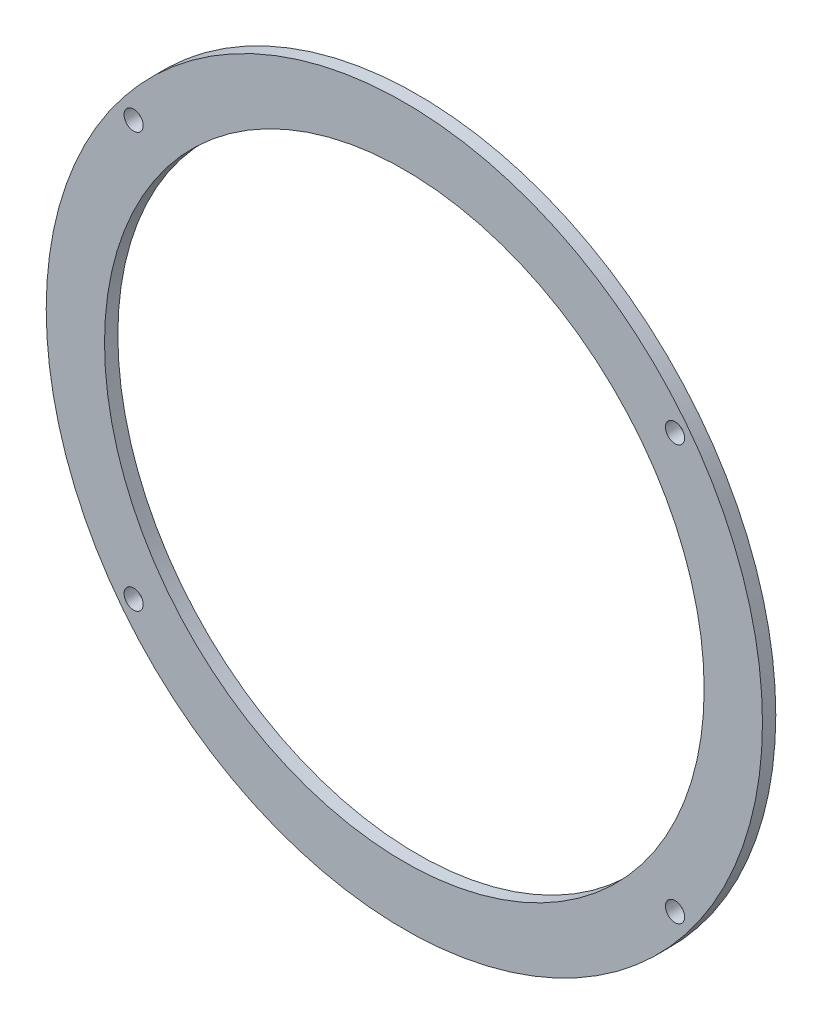
ISO-10303-21;
HEADER;
FILE_DESCRIPTION(('STEP AP214'),'2;1');
FILE_NAME('part.step','',(''),(''),'','','');
FILE_SCHEMA(('AUTOMOTIVE_DESIGN { 1 0 10303 214 1 1 1 1 }'));
ENDSEC;
DATA;
#1=APPLICATION_CONTEXT('core data for automotive mechanical design processes');
#2=APPLICATION_PROTOCOL_DEFINITION('international standard','automotive_design',2000,#1);
#3=PRODUCT_CONTEXT('',#1,'mechanical');
#4=PRODUCT('Part','Part','',(#3));
#5=PRODUCT_RELATED_PRODUCT_CATEGORY('part','',(#4));
#6=PRODUCT_DEFINITION_FORMATION('','',#4);
#7=PRODUCT_DEFINITION_CONTEXT('part definition',#1,'design');
#8=PRODUCT_DEFINITION('design','',#6,#7);
#9=PRODUCT_DEFINITION_SHAPE('','',#8);
#10=(LENGTH_UNIT() NAMED_UNIT(*) SI_UNIT(.MILLI.,.METRE.));
#11=(NAMED_UNIT(*) PLANE_ANGLE_UNIT() SI_UNIT($,.RADIAN.));
#12=(NAMED_UNIT(*) SI_UNIT($,.STERADIAN.) SOLID_ANGLE_UNIT());
#13=UNCERTAINTY_MEASURE_WITH_UNIT(LENGTH_MEASURE(1.E-05),#10,'distance_accuracy_value','');
#14=(GEOMETRIC_REPRESENTATION_CONTEXT(3) GLOBAL_UNCERTAINTY_ASSIGNED_CONTEXT((#13)) GLOBAL_UNIT_ASSIGNED_CONTEXT((#10,
#11,#12)) REPRESENTATION_CONTEXT('',''));
#15=CARTESIAN_POINT('',(0.,0.,0.));
#16=DIRECTION('',(0.,0.,1.));
#17=DIRECTION('',(1.,0.,0.));
#18=AXIS2_PLACEMENT_3D('',#15,#16,#17);
#19=CARTESIAN_POINT('',(0.,0.,0.));
#20=DIRECTION('',(0.,0.,1.));
#21=DIRECTION('',(1.,0.,0.));
#22=AXIS2_PLACEMENT_3D('',#19,#20,#21);
#23=PLANE('',#22);
#24=DIRECTION('',(0.,1.,0.));
#25=VECTOR('',#24,1.);
#26=CARTESIAN_POINT('',(3.3,41.8,0.));
#27=LINE('',#26,#25);
#28=CARTESIAN_POINT('',(3.3,39.5,0.));
#29=VERTEX_POINT('',#28);
#30=CARTESIAN_POINT('',(3.3,41.8,0.));
#31=VERTEX_POINT('',#30);
#32=EDGE_CURVE('E223',#29,#31,#27,.T.);
#33=ORIENTED_EDGE('',*,*,#32,.F.);
#34=DIRECTION('',(-1.,0.,0.));
#35=VECTOR('',#34,1.);
#36=CARTESIAN_POINT('',(3.3,39.5,0.));
#37=LINE('',#36,#35);
#38=CARTESIAN_POINT('',(4.5,39.5,0.));
#39=VERTEX_POINT('',#38);
#40=EDGE_CURVE('E236',#39,#29,#37,.T.);
#41=ORIENTED_EDGE('',*,*,#40,.F.);
#42=DIRECTION('',(0.,-1.,0.));
#43=VECTOR('',#42,1.);
#44=CARTESIAN_POINT('',(4.5,41.8,0.));
#45=LINE('',#44,#43);
#46=CARTESIAN_POINT('',(4.5,41.8,0.));
#47=VERTEX_POINT('',#46);
#48=EDGE_CURVE('E245',#47,#39,#45,.T.);
#49=ORIENTED_EDGE('',*,*,#48,.F.);
#50=DIRECTION('',(1.,0.,0.));
#51=VECTOR('',#50,1.);
#52=CARTESIAN_POINT('',(3.3,41.8,0.));
#53=LINE('',#52,#51);
#54=EDGE_CURVE('E226',#31,#47,#53,.T.);
#55=ORIENTED_EDGE('',*,*,#54,.F.);
#56=EDGE_LOOP('',(#33,#41,#49,#55));
#57=FACE_BOUND('',#56,.T.);
#58=DIRECTION('',(0.,1.,0.));
#59=VECTOR('',#58,1.);
#60=CARTESIAN_POINT('',(0.7,41.8,0.));
#61=LINE('',#60,#59);
#62=CARTESIAN_POINT('',(0.700000000000001,39.5,0.));
#63=VERTEX_POINT('',#62);
#64=CARTESIAN_POINT('',(0.7,41.8,0.));
#65=VERTEX_POINT('',#64);
#66=EDGE_CURVE('E294',#63,#65,#61,.T.);
#67=ORIENTED_EDGE('',*,*,#66,.F.);
#68=DIRECTION('',(-1.,0.,0.));
#69=VECTOR('',#68,1.);
#70=CARTESIAN_POINT('',(0.700000000000001,39.5,0.));
#71=LINE('',#70,#69);
#72=CARTESIAN_POINT('',(1.9,39.5,0.));
#73=VERTEX_POINT('',#72);
#74=EDGE_CURVE('E299',#73,#63,#71,.T.);
#75=ORIENTED_EDGE('',*,*,#74,.F.);
#76=DIRECTION('',(0.,-1.,0.));
#77=VECTOR('',#76,1.);
#78=CARTESIAN_POINT('',(1.9,41.8,0.));
#79=LINE('',#78,#77);
#80=CARTESIAN_POINT('',(1.9,41.8,0.));
#81=VERTEX_POINT('',#80);
#82=EDGE_CURVE('E311',#81,#73,#79,.T.);
#83=ORIENTED_EDGE('',*,*,#82,.F.);
#84=DIRECTION('',(1.,0.,0.));
#85=VECTOR('',#84,1.);
#86=CARTESIAN_POINT('',(0.7,41.8,0.));
#87=LINE('',#86,#85);
#88=EDGE_CURVE('E308',#65,#81,#87,.T.);
#89=ORIENTED_EDGE('',*,*,#88,.F.);
#90=EDGE_LOOP('',(#67,#75,#83,#89));
#91=FACE_BOUND('',#90,.T.);
#92=CARTESIAN_POINT('',(0.,0.,0.));
#93=DIRECTION('',(0.,0.,1.));
#94=DIRECTION('',(1.,0.,0.));
#95=AXIS2_PLACEMENT_3D('',#92,#93,#94);
#96=CIRCLE('',#95,43.);
#97=CARTESIAN_POINT('',(43.,0.,0.));
#98=VERTEX_POINT('',#97);
#99=EDGE_CURVE('E93',#98,#98,#96,.T.);
#100=ORIENTED_EDGE('',*,*,#99,.F.);
#101=EDGE_LOOP('',(#100));
#102=FACE_BOUND('',#101,.T.);
#103=CARTESIAN_POINT('',(32.5,-24.9,0.));
#104=DIRECTION('',(0.,0.,1.));
#105=DIRECTION('',(1.,0.,0.));
#106=AXIS2_PLACEMENT_3D('',#103,#104,#105);
#107=CIRCLE('',#106,1.15);
#108=CARTESIAN_POINT('',(33.65,-24.9,0.));
#109=VERTEX_POINT('',#108);
#110=EDGE_CURVE('E349',#109,#109,#107,.T.);
#111=ORIENTED_EDGE('',*,*,#110,.T.);
#112=EDGE_LOOP('',(#111));
#113=FACE_BOUND('',#112,.T.);
#114=CARTESIAN_POINT('',(-32.5,-24.9,0.));
#115=DIRECTION('',(0.,0.,1.));
#116=DIRECTION('',(1.,0.,0.));
#117=AXIS2_PLACEMENT_3D('',#114,#115,#116);
#118=CIRCLE('',#117,1.15);
#119=CARTESIAN_POINT('',(-31.35,-24.9,0.));
#120=VERTEX_POINT('',#119);
#121=EDGE_CURVE('E343',#120,#120,#118,.T.);
#122=ORIENTED_EDGE('',*,*,#121,.T.);
#123=EDGE_LOOP('',(#122));
#124=FACE_BOUND('',#123,.T.);
#125=CARTESIAN_POINT('',(0.,0.,0.));
#126=DIRECTION('',(0.,0.,1.));
#127=DIRECTION('',(1.,0.,0.));
#128=AXIS2_PLACEMENT_3D('',#125,#126,#127);
#129=CIRCLE('',#128,36.);
#130=CARTESIAN_POINT('',(36.,0.,0.));
#131=VERTEX_POINT('',#130);
#132=EDGE_CURVE('E337',#131,#131,#129,.T.);
#133=ORIENTED_EDGE('',*,*,#132,.T.);
#134=EDGE_LOOP('',(#133));
#135=FACE_BOUND('',#134,.T.);
#136=CARTESIAN_POINT('',(-32.5,24.9,0.));
#137=DIRECTION('',(0.,0.,1.));
#138=DIRECTION('',(1.,0.,0.));
#139=AXIS2_PLACEMENT_3D('',#136,#137,#138);
#140=CIRCLE('',#139,1.15);
#141=CARTESIAN_POINT('',(-31.35,24.9,0.));
#142=VERTEX_POINT('',#141);
#143=EDGE_CURVE('E331',#142,#142,#140,.T.);
#144=ORIENTED_EDGE('',*,*,#143,.T.);
#145=EDGE_LOOP('',(#144));
#146=FACE_BOUND('',#145,.T.);
#147=CARTESIAN_POINT('',(32.5,24.9,0.));
#148=DIRECTION('',(0.,0.,1.));
#149=DIRECTION('',(1.,0.,0.));
#150=AXIS2_PLACEMENT_3D('',#147,#148,#149);
#151=CIRCLE('',#150,1.15);
#152=CARTESIAN_POINT('',(33.65,24.9,0.));
#153=VERTEX_POINT('',#152);
#154=EDGE_CURVE('E327',#153,#153,#151,.T.);
#155=ORIENTED_EDGE('',*,*,#154,.T.);
#156=EDGE_LOOP('',(#155));
#157=FACE_BOUND('',#156,.T.);
#158=DIRECTION('',(0.,1.,0.));
#159=VECTOR('',#158,1.);
#160=CARTESIAN_POINT('',(-4.5,41.8,0.));
#161=LINE('',#160,#159);
#162=CARTESIAN_POINT('',(-4.5,39.5,0.));
#163=VERTEX_POINT('',#162);
#164=CARTESIAN_POINT('',(-4.5,41.8,0.));
#165=VERTEX_POINT('',#164);
#166=EDGE_CURVE('E261',#163,#165,#161,.T.);
#167=ORIENTED_EDGE('',*,*,#166,.F.);
#168=DIRECTION('',(-1.,0.,0.));
#169=VECTOR('',#168,1.);
#170=CARTESIAN_POINT('',(-3.3,39.5,0.));
#171=LINE('',#170,#169);
#172=CARTESIAN_POINT('',(-3.3,39.5,0.));
#173=VERTEX_POINT('',#172);
#174=EDGE_CURVE('E266',#173,#163,#171,.T.);
#175=ORIENTED_EDGE('',*,*,#174,.F.);
#176=DIRECTION('',(0.,-1.,0.));
#177=VECTOR('',#176,1.);
#178=CARTESIAN_POINT('',(-3.3,41.8,0.));
#179=LINE('',#178,#177);
#180=CARTESIAN_POINT('',(-3.3,41.8,0.));
#181=VERTEX_POINT('',#180);
#182=EDGE_CURVE('E278',#181,#173,#179,.T.);
#183=ORIENTED_EDGE('',*,*,#182,.F.);
#184=DIRECTION('',(1.,0.,0.));
#185=VECTOR('',#184,1.);
#186=CARTESIAN_POINT('',(-3.3,41.8,0.));
#187=LINE('',#186,#185);
#188=EDGE_CURVE('E275',#165,#181,#187,.T.);
#189=ORIENTED_EDGE('',*,*,#188,.F.);
#190=EDGE_LOOP('',(#167,#175,#183,#189));
#191=FACE_BOUND('',#190,.T.);
#192=DIRECTION('',(0.,-1.,0.));
#193=VECTOR('',#192,1.);
#194=CARTESIAN_POINT('',(-0.7,41.8,0.));
#195=LINE('',#194,#193);
#196=CARTESIAN_POINT('',(-0.7,41.8,0.));
#197=VERTEX_POINT('',#196);
#198=CARTESIAN_POINT('',(-0.700000000000001,39.5,0.));
#199=VERTEX_POINT('',#198);
#200=EDGE_CURVE('E222',#197,#199,#195,.T.);
#201=ORIENTED_EDGE('',*,*,#200,.F.);
#202=DIRECTION('',(1.,0.,0.));
#203=VECTOR('',#202,1.);
#204=CARTESIAN_POINT('',(-0.7,41.8,0.));
#205=LINE('',#204,#203);
#206=CARTESIAN_POINT('',(-1.9,41.8,0.));
#207=VERTEX_POINT('',#206);
#208=EDGE_CURVE('E219',#207,#197,#205,.T.);
#209=ORIENTED_EDGE('',*,*,#208,.F.);
#210=DIRECTION('',(0.,1.,0.));
#211=VECTOR('',#210,1.);
#212=CARTESIAN_POINT('',(-1.9,41.8,0.));
#213=LINE('',#212,#211);
#214=CARTESIAN_POINT('',(-1.9,39.5,0.));
#215=VERTEX_POINT('',#214);
#216=EDGE_CURVE('E109',#215,#207,#213,.T.);
#217=ORIENTED_EDGE('',*,*,#216,.F.);
#218=DIRECTION('',(-1.,0.,0.));
#219=VECTOR('',#218,1.);
#220=CARTESIAN_POINT('',(-0.700000000000001,39.5,0.));
#221=LINE('',#220,#219);
#222=EDGE_CURVE('E104',#199,#215,#221,.T.);
#223=ORIENTED_EDGE('',*,*,#222,.F.);
#224=EDGE_LOOP('',(#201,#209,#217,#223));
#225=FACE_BOUND('',#224,.T.);
#226=ADVANCED_FACE('F89',(#57,#91,#102,#113,#124,#135,#146,#157,#191,#225),#23,.F.);
#227=CARTESIAN_POINT('',(0.,0.,1.6));
#228=DIRECTION('',(0.,0.,1.));
#229=DIRECTION('',(1.,0.,0.));
#230=AXIS2_PLACEMENT_3D('',#227,#228,#229);
#231=PLANE('',#230);
#232=CARTESIAN_POINT('',(-32.5,24.9,1.6));
#233=DIRECTION('',(0.,0.,1.));
#234=DIRECTION('',(1.,0.,0.));
#235=AXIS2_PLACEMENT_3D('',#232,#233,#234);
#236=CIRCLE('',#235,1.15);
#237=CARTESIAN_POINT('',(-31.35,24.9,1.6));
#238=VERTEX_POINT('',#237);
#239=EDGE_CURVE('E334',#238,#238,#236,.T.);
#240=ORIENTED_EDGE('',*,*,#239,.F.);
#241=EDGE_LOOP('',(#240));
#242=FACE_BOUND('',#241,.T.);
#243=CARTESIAN_POINT('',(-32.5,-24.9,1.6));
#244=DIRECTION('',(0.,0.,1.));
#245=DIRECTION('',(1.,0.,0.));
#246=AXIS2_PLACEMENT_3D('',#243,#244,#245);
#247=CIRCLE('',#246,1.15);
#248=CARTESIAN_POINT('',(-31.35,-24.9,1.6));
#249=VERTEX_POINT('',#248);
#250=EDGE_CURVE('E346',#249,#249,#247,.T.);
#251=ORIENTED_EDGE('',*,*,#250,.F.);
#252=EDGE_LOOP('',(#251));
#253=FACE_BOUND('',#252,.T.);
#254=CARTESIAN_POINT('',(0.,0.,1.6));
#255=DIRECTION('',(0.,0.,1.));
#256=DIRECTION('',(1.,0.,0.));
#257=AXIS2_PLACEMENT_3D('',#254,#255,#256);
#258=CIRCLE('',#257,43.);
#259=CARTESIAN_POINT('',(43.,0.,1.6));
#260=VERTEX_POINT('',#259);
#261=EDGE_CURVE('E12',#260,#260,#258,.T.);
#262=ORIENTED_EDGE('',*,*,#261,.T.);
#263=EDGE_LOOP('',(#262));
#264=FACE_BOUND('',#263,.T.);
#265=CARTESIAN_POINT('',(32.5,-24.9,1.6));
#266=DIRECTION('',(0.,0.,1.));
#267=DIRECTION('',(1.,0.,0.));
#268=AXIS2_PLACEMENT_3D('',#265,#266,#267);
#269=CIRCLE('',#268,1.15);
#270=CARTESIAN_POINT('',(33.65,-24.9,1.6));
#271=VERTEX_POINT('',#270);
#272=EDGE_CURVE('E352',#271,#271,#269,.T.);
#273=ORIENTED_EDGE('',*,*,#272,.F.);
#274=EDGE_LOOP('',(#273));
#275=FACE_BOUND('',#274,.T.);
#276=CARTESIAN_POINT('',(0.,0.,1.6));
#277=DIRECTION('',(0.,0.,1.));
#278=DIRECTION('',(1.,0.,0.));
#279=AXIS2_PLACEMENT_3D('',#276,#277,#278);
#280=CIRCLE('',#279,36.);
#281=CARTESIAN_POINT('',(36.,0.,1.6));
#282=VERTEX_POINT('',#281);
#283=EDGE_CURVE('E340',#282,#282,#280,.T.);
#284=ORIENTED_EDGE('',*,*,#283,.F.);
#285=EDGE_LOOP('',(#284));
#286=FACE_BOUND('',#285,.T.);
#287=CARTESIAN_POINT('',(32.5,24.9,1.6));
#288=DIRECTION('',(0.,0.,1.));
#289=DIRECTION('',(1.,0.,0.));
#290=AXIS2_PLACEMENT_3D('',#287,#288,#289);
#291=CIRCLE('',#290,1.15);
#292=CARTESIAN_POINT('',(33.65,24.9,1.6));
#293=VERTEX_POINT('',#292);
#294=EDGE_CURVE('E328',#293,#293,#291,.T.);
#295=ORIENTED_EDGE('',*,*,#294,.F.);
#296=EDGE_LOOP('',(#295));
#297=FACE_BOUND('',#296,.T.);
#298=ADVANCED_FACE('F372',(#242,#253,#264,#275,#286,#297),#231,.T.);
#299=CARTESIAN_POINT('',(0.,0.,1.6));
#300=DIRECTION('',(0.,0.,-1.));
#301=DIRECTION('',(-1.,0.,0.));
#302=AXIS2_PLACEMENT_3D('',#299,#300,#301);
#303=CYLINDRICAL_SURFACE('',#302,43.);
#304=ORIENTED_EDGE('',*,*,#261,.F.);
#305=EDGE_LOOP('',(#304));
#306=FACE_BOUND('',#305,.T.);
#307=ORIENTED_EDGE('',*,*,#99,.T.);
#308=EDGE_LOOP('',(#307));
#309=FACE_BOUND('',#308,.T.);
#310=ADVANCED_FACE('F91',(#306,#309),#303,.T.);
#311=CARTESIAN_POINT('',(32.5,-24.9,1.6));
#312=DIRECTION('',(0.,0.,-1.));
#313=DIRECTION('',(-1.,0.,0.));
#314=AXIS2_PLACEMENT_3D('',#311,#312,#313);
#315=CYLINDRICAL_SURFACE('',#314,1.15);
#316=ORIENTED_EDGE('',*,*,#272,.T.);
#317=EDGE_LOOP('',(#316));
#318=FACE_BOUND('',#317,.T.);
#319=ORIENTED_EDGE('',*,*,#110,.F.);
#320=EDGE_LOOP('',(#319));
#321=FACE_BOUND('',#320,.T.);
#322=ADVANCED_FACE('F360',(#318,#321),#315,.F.);
#323=CARTESIAN_POINT('',(-32.5,-24.9,1.6));
#324=DIRECTION('',(0.,0.,-1.));
#325=DIRECTION('',(-1.,0.,0.));
#326=AXIS2_PLACEMENT_3D('',#323,#324,#325);
#327=CYLINDRICAL_SURFACE('',#326,1.15);
#328=ORIENTED_EDGE('',*,*,#250,.T.);
#329=EDGE_LOOP('',(#328));
#330=FACE_BOUND('',#329,.T.);
#331=ORIENTED_EDGE('',*,*,#121,.F.);
#332=EDGE_LOOP('',(#331));
#333=FACE_BOUND('',#332,.T.);
#334=ADVANCED_FACE('F362',(#330,#333),#327,.F.);
#335=CARTESIAN_POINT('',(0.,0.,1.6));
#336=DIRECTION('',(0.,0.,-1.));
#337=DIRECTION('',(-1.,0.,0.));
#338=AXIS2_PLACEMENT_3D('',#335,#336,#337);
#339=CYLINDRICAL_SURFACE('',#338,36.);
#340=ORIENTED_EDGE('',*,*,#283,.T.);
#341=EDGE_LOOP('',(#340));
#342=FACE_BOUND('',#341,.T.);
#343=ORIENTED_EDGE('',*,*,#132,.F.);
#344=EDGE_LOOP('',(#343));
#345=FACE_BOUND('',#344,.T.);
#346=ADVANCED_FACE('F369',(#342,#345),#339,.F.);
#347=CARTESIAN_POINT('',(-32.5,24.9,1.6));
#348=DIRECTION('',(0.,0.,-1.));
#349=DIRECTION('',(-1.,0.,0.));
#350=AXIS2_PLACEMENT_3D('',#347,#348,#349);
#351=CYLINDRICAL_SURFACE('',#350,1.15);
#352=ORIENTED_EDGE('',*,*,#239,.T.);
#353=EDGE_LOOP('',(#352));
#354=FACE_BOUND('',#353,.T.);
#355=ORIENTED_EDGE('',*,*,#143,.F.);
#356=EDGE_LOOP('',(#355));
#357=FACE_BOUND('',#356,.T.);
#358=ADVANCED_FACE('F416',(#354,#357),#351,.F.);
#359=CARTESIAN_POINT('',(32.5,24.9,1.6));
#360=DIRECTION('',(0.,0.,-1.));
#361=DIRECTION('',(-1.,0.,0.));
#362=AXIS2_PLACEMENT_3D('',#359,#360,#361);
#363=CYLINDRICAL_SURFACE('',#362,1.15);
#364=ORIENTED_EDGE('',*,*,#294,.T.);
#365=EDGE_LOOP('',(#364));
#366=FACE_BOUND('',#365,.T.);
#367=ORIENTED_EDGE('',*,*,#154,.F.);
#368=EDGE_LOOP('',(#367));
#369=FACE_BOUND('',#368,.T.);
#370=ADVANCED_FACE('F410',(#366,#369),#363,.F.);
#371=CARTESIAN_POINT('',(0.7,41.8,-0.1));
#372=DIRECTION('',(1.,0.,0.));
#373=DIRECTION('',(0.,1.,0.));
#374=AXIS2_PLACEMENT_3D('',#371,#372,#373);
#375=PLANE('',#374);
#376=ORIENTED_EDGE('',*,*,#66,.T.);
#377=DIRECTION('',(0.,0.,1.));
#378=VECTOR('',#377,1.);
#379=CARTESIAN_POINT('',(0.7,41.8,-0.1));
#380=LINE('',#379,#378);
#381=CARTESIAN_POINT('',(0.7,41.8,-0.1));
#382=VERTEX_POINT('',#381);
#383=EDGE_CURVE('E324',#382,#65,#380,.T.);
#384=ORIENTED_EDGE('',*,*,#383,.F.);
#385=DIRECTION('',(0.,1.,0.));
#386=VECTOR('',#385,1.);
#387=CARTESIAN_POINT('',(0.7,41.8,-0.1));
#388=LINE('',#387,#386);
#389=CARTESIAN_POINT('',(0.700000000000001,39.5,-0.1));
#390=VERTEX_POINT('',#389);
#391=EDGE_CURVE('E295',#390,#382,#388,.T.);
#392=ORIENTED_EDGE('',*,*,#391,.F.);
#393=DIRECTION('',(0.,0.,1.));
#394=VECTOR('',#393,1.);
#395=CARTESIAN_POINT('',(0.700000000000001,39.5,-0.1));
#396=LINE('',#395,#394);
#397=EDGE_CURVE('E305',#390,#63,#396,.T.);
#398=ORIENTED_EDGE('',*,*,#397,.T.);
#399=EDGE_LOOP('',(#376,#384,#392,#398));
#400=FACE_BOUND('',#399,.T.);
#401=ADVANCED_FACE('F394',(#400),#375,.F.);
#402=CARTESIAN_POINT('',(0.7,41.8,-0.1));
#403=DIRECTION('',(0.,-1.,0.));
#404=DIRECTION('',(0.,0.,-1.));
#405=AXIS2_PLACEMENT_3D('',#402,#403,#404);
#406=PLANE('',#405);
#407=ORIENTED_EDGE('',*,*,#88,.T.);
#408=DIRECTION('',(0.,0.,1.));
#409=VECTOR('',#408,1.);
#410=CARTESIAN_POINT('',(1.9,41.8,-0.1));
#411=LINE('',#410,#409);
#412=CARTESIAN_POINT('',(1.9,41.8,-0.1));
#413=VERTEX_POINT('',#412);
#414=EDGE_CURVE('E321',#413,#81,#411,.T.);
#415=ORIENTED_EDGE('',*,*,#414,.F.);
#416=DIRECTION('',(1.,0.,0.));
#417=VECTOR('',#416,1.);
#418=CARTESIAN_POINT('',(0.7,41.8,-0.1));
#419=LINE('',#418,#417);
#420=EDGE_CURVE('E298',#382,#413,#419,.T.);
#421=ORIENTED_EDGE('',*,*,#420,.F.);
#422=ORIENTED_EDGE('',*,*,#383,.T.);
#423=EDGE_LOOP('',(#407,#415,#421,#422));
#424=FACE_BOUND('',#423,.T.);
#425=ADVANCED_FACE('F402',(#424),#406,.F.);
#426=CARTESIAN_POINT('',(1.9,41.8,-0.1));
#427=DIRECTION('',(-1.,0.,0.));
#428=DIRECTION('',(0.,-1.,0.));
#429=AXIS2_PLACEMENT_3D('',#426,#427,#428);
#430=PLANE('',#429);
#431=ORIENTED_EDGE('',*,*,#82,.T.);
#432=DIRECTION('',(0.,0.,1.));
#433=VECTOR('',#432,1.);
#434=CARTESIAN_POINT('',(1.9,39.5,-0.1));
#435=LINE('',#434,#433);
#436=CARTESIAN_POINT('',(1.9,39.5,-0.1));
#437=VERTEX_POINT('',#436);
#438=EDGE_CURVE('E318',#437,#73,#435,.T.);
#439=ORIENTED_EDGE('',*,*,#438,.F.);
#440=DIRECTION('',(0.,-1.,0.));
#441=VECTOR('',#440,1.);
#442=CARTESIAN_POINT('',(1.9,41.8,-0.1));
#443=LINE('',#442,#441);
#444=EDGE_CURVE('E301',#413,#437,#443,.T.);
#445=ORIENTED_EDGE('',*,*,#444,.F.);
#446=ORIENTED_EDGE('',*,*,#414,.T.);
#447=EDGE_LOOP('',(#431,#439,#445,#446));
#448=FACE_BOUND('',#447,.T.);
#449=ADVANCED_FACE('F400',(#448),#430,.F.);
#450=CARTESIAN_POINT('',(0.700000000000001,39.5,-0.1));
#451=DIRECTION('',(0.,1.,0.));
#452=DIRECTION('',(0.,0.,1.));
#453=AXIS2_PLACEMENT_3D('',#450,#451,#452);
#454=PLANE('',#453);
#455=ORIENTED_EDGE('',*,*,#74,.T.);
#456=ORIENTED_EDGE('',*,*,#397,.F.);
#457=DIRECTION('',(-1.,0.,0.));
#458=VECTOR('',#457,1.);
#459=CARTESIAN_POINT('',(0.700000000000001,39.5,-0.1));
#460=LINE('',#459,#458);
#461=EDGE_CURVE('E303',#437,#390,#460,.T.);
#462=ORIENTED_EDGE('',*,*,#461,.F.);
#463=ORIENTED_EDGE('',*,*,#438,.T.);
#464=EDGE_LOOP('',(#455,#456,#462,#463));
#465=FACE_BOUND('',#464,.T.);
#466=ADVANCED_FACE('F390',(#465),#454,.F.);
#467=CARTESIAN_POINT('',(0.,0.,-0.1));
#468=DIRECTION('',(0.,0.,1.));
#469=DIRECTION('',(1.,0.,0.));
#470=AXIS2_PLACEMENT_3D('',#467,#468,#469);
#471=PLANE('',#470);
#472=ORIENTED_EDGE('',*,*,#391,.T.);
#473=ORIENTED_EDGE('',*,*,#420,.T.);
#474=ORIENTED_EDGE('',*,*,#444,.T.);
#475=ORIENTED_EDGE('',*,*,#461,.T.);
#476=EDGE_LOOP('',(#472,#473,#474,#475));
#477=FACE_BOUND('',#476,.T.);
#478=ADVANCED_FACE('F396',(#477),#471,.F.);
#479=CARTESIAN_POINT('',(-4.5,41.8,-0.1));
#480=DIRECTION('',(1.,0.,0.));
#481=DIRECTION('',(0.,0.,-1.));
#482=AXIS2_PLACEMENT_3D('',#479,#480,#481);
#483=PLANE('',#482);
#484=ORIENTED_EDGE('',*,*,#166,.T.);
#485=DIRECTION('',(0.,0.,1.));
#486=VECTOR('',#485,1.);
#487=CARTESIAN_POINT('',(-4.5,41.8,-0.1));
#488=LINE('',#487,#486);
#489=CARTESIAN_POINT('',(-4.5,41.8,-0.1));
#490=VERTEX_POINT('',#489);
#491=EDGE_CURVE('E291',#490,#165,#488,.T.);
#492=ORIENTED_EDGE('',*,*,#491,.F.);
#493=DIRECTION('',(0.,1.,0.));
#494=VECTOR('',#493,1.);
#495=CARTESIAN_POINT('',(-4.5,41.8,-0.1));
#496=LINE('',#495,#494);
#497=CARTESIAN_POINT('',(-4.5,39.5,-0.1));
#498=VERTEX_POINT('',#497);
#499=EDGE_CURVE('E262',#498,#490,#496,.T.);
#500=ORIENTED_EDGE('',*,*,#499,.F.);
#501=DIRECTION('',(0.,0.,1.));
#502=VECTOR('',#501,1.);
#503=CARTESIAN_POINT('',(-4.5,39.5,-0.1));
#504=LINE('',#503,#502);
#505=EDGE_CURVE('E272',#498,#163,#504,.T.);
#506=ORIENTED_EDGE('',*,*,#505,.T.);
#507=EDGE_LOOP('',(#484,#492,#500,#506));
#508=FACE_BOUND('',#507,.T.);
#509=ADVANCED_FACE('F496',(#508),#483,.F.);
#510=CARTESIAN_POINT('',(-3.3,41.8,-0.1));
#511=DIRECTION('',(0.,-1.,0.));
#512=DIRECTION('',(0.,0.,-1.));
#513=AXIS2_PLACEMENT_3D('',#510,#511,#512);
#514=PLANE('',#513);
#515=ORIENTED_EDGE('',*,*,#188,.T.);
#516=DIRECTION('',(0.,0.,1.));
#517=VECTOR('',#516,1.);
#518=CARTESIAN_POINT('',(-3.3,41.8,-0.1));
#519=LINE('',#518,#517);
#520=CARTESIAN_POINT('',(-3.3,41.8,-0.1));
#521=VERTEX_POINT('',#520);
#522=EDGE_CURVE('E288',#521,#181,#519,.T.);
#523=ORIENTED_EDGE('',*,*,#522,.F.);
#524=DIRECTION('',(1.,0.,0.));
#525=VECTOR('',#524,1.);
#526=CARTESIAN_POINT('',(-3.3,41.8,-0.1));
#527=LINE('',#526,#525);
#528=EDGE_CURVE('E265',#490,#521,#527,.T.);
#529=ORIENTED_EDGE('',*,*,#528,.F.);
#530=ORIENTED_EDGE('',*,*,#491,.T.);
#531=EDGE_LOOP('',(#515,#523,#529,#530));
#532=FACE_BOUND('',#531,.T.);
#533=ADVANCED_FACE('F492',(#532),#514,.F.);
#534=CARTESIAN_POINT('',(-3.3,41.8,-0.1));
#535=DIRECTION('',(-1.,0.,0.));
#536=DIRECTION('',(0.,-1.,0.));
#537=AXIS2_PLACEMENT_3D('',#534,#535,#536);
#538=PLANE('',#537);
#539=ORIENTED_EDGE('',*,*,#182,.T.);
#540=DIRECTION('',(0.,0.,1.));
#541=VECTOR('',#540,1.);
#542=CARTESIAN_POINT('',(-3.3,39.5,-0.1));
#543=LINE('',#542,#541);
#544=CARTESIAN_POINT('',(-3.3,39.5,-0.1));
#545=VERTEX_POINT('',#544);
#546=EDGE_CURVE('E285',#545,#173,#543,.T.);
#547=ORIENTED_EDGE('',*,*,#546,.F.);
#548=DIRECTION('',(0.,-1.,0.));
#549=VECTOR('',#548,1.);
#550=CARTESIAN_POINT('',(-3.3,41.8,-0.1));
#551=LINE('',#550,#549);
#552=EDGE_CURVE('E268',#521,#545,#551,.T.);
#553=ORIENTED_EDGE('',*,*,#552,.F.);
#554=ORIENTED_EDGE('',*,*,#522,.T.);
#555=EDGE_LOOP('',(#539,#547,#553,#554));
#556=FACE_BOUND('',#555,.T.);
#557=ADVANCED_FACE('F488',(#556),#538,.F.);
#558=CARTESIAN_POINT('',(-3.3,39.5,-0.1));
#559=DIRECTION('',(0.,1.,0.));
#560=DIRECTION('',(0.,0.,1.));
#561=AXIS2_PLACEMENT_3D('',#558,#559,#560);
#562=PLANE('',#561);
#563=ORIENTED_EDGE('',*,*,#174,.T.);
#564=ORIENTED_EDGE('',*,*,#505,.F.);
#565=DIRECTION('',(-1.,0.,0.));
#566=VECTOR('',#565,1.);
#567=CARTESIAN_POINT('',(-3.3,39.5,-0.1));
#568=LINE('',#567,#566);
#569=EDGE_CURVE('E270',#545,#498,#568,.T.);
#570=ORIENTED_EDGE('',*,*,#569,.F.);
#571=ORIENTED_EDGE('',*,*,#546,.T.);
#572=EDGE_LOOP('',(#563,#564,#570,#571));
#573=FACE_BOUND('',#572,.T.);
#574=ADVANCED_FACE('F484',(#573),#562,.F.);
#575=CARTESIAN_POINT('',(0.,0.,-0.1));
#576=DIRECTION('',(0.,0.,-1.));
#577=DIRECTION('',(-1.,0.,0.));
#578=AXIS2_PLACEMENT_3D('',#575,#576,#577);
#579=PLANE('',#578);
#580=ORIENTED_EDGE('',*,*,#499,.T.);
#581=ORIENTED_EDGE('',*,*,#528,.T.);
#582=ORIENTED_EDGE('',*,*,#552,.T.);
#583=ORIENTED_EDGE('',*,*,#569,.T.);
#584=EDGE_LOOP('',(#580,#581,#582,#583));
#585=FACE_BOUND('',#584,.T.);
#586=ADVANCED_FACE('F480',(#585),#579,.T.);
#587=CARTESIAN_POINT('',(3.3,41.8,-0.1));
#588=DIRECTION('',(1.,0.,0.));
#589=DIRECTION('',(0.,1.,0.));
#590=AXIS2_PLACEMENT_3D('',#587,#588,#589);
#591=PLANE('',#590);
#592=ORIENTED_EDGE('',*,*,#32,.T.);
#593=DIRECTION('',(0.,0.,1.));
#594=VECTOR('',#593,1.);
#595=CARTESIAN_POINT('',(3.3,41.8,-0.1));
#596=LINE('',#595,#594);
#597=CARTESIAN_POINT('',(3.3,41.8,-0.1));
#598=VERTEX_POINT('',#597);
#599=EDGE_CURVE('E258',#598,#31,#596,.T.);
#600=ORIENTED_EDGE('',*,*,#599,.F.);
#601=DIRECTION('',(0.,1.,0.));
#602=VECTOR('',#601,1.);
#603=CARTESIAN_POINT('',(3.3,41.8,-0.1));
#604=LINE('',#603,#602);
#605=CARTESIAN_POINT('',(3.3,39.5,-0.1));
#606=VERTEX_POINT('',#605);
#607=EDGE_CURVE('E232',#606,#598,#604,.T.);
#608=ORIENTED_EDGE('',*,*,#607,.F.);
#609=DIRECTION('',(0.,0.,1.));
#610=VECTOR('',#609,1.);
#611=CARTESIAN_POINT('',(3.3,39.5,-0.1));
#612=LINE('',#611,#610);
#613=EDGE_CURVE('E241',#606,#29,#612,.T.);
#614=ORIENTED_EDGE('',*,*,#613,.T.);
#615=EDGE_LOOP('',(#592,#600,#608,#614));
#616=FACE_BOUND('',#615,.T.);
#617=ADVANCED_FACE('F476',(#616),#591,.F.);
#618=CARTESIAN_POINT('',(3.3,41.8,-0.1));
#619=DIRECTION('',(0.,-1.,0.));
#620=DIRECTION('',(0.,0.,-1.));
#621=AXIS2_PLACEMENT_3D('',#618,#619,#620);
#622=PLANE('',#621);
#623=ORIENTED_EDGE('',*,*,#54,.T.);
#624=DIRECTION('',(0.,0.,1.));
#625=VECTOR('',#624,1.);
#626=CARTESIAN_POINT('',(4.5,41.8,-0.1));
#627=LINE('',#626,#625);
#628=CARTESIAN_POINT('',(4.5,41.8,-0.1));
#629=VERTEX_POINT('',#628);
#630=EDGE_CURVE('E255',#629,#47,#627,.T.);
#631=ORIENTED_EDGE('',*,*,#630,.F.);
#632=DIRECTION('',(1.,0.,0.));
#633=VECTOR('',#632,1.);
#634=CARTESIAN_POINT('',(3.3,41.8,-0.1));
#635=LINE('',#634,#633);
#636=EDGE_CURVE('E235',#598,#629,#635,.T.);
#637=ORIENTED_EDGE('',*,*,#636,.F.);
#638=ORIENTED_EDGE('',*,*,#599,.T.);
#639=EDGE_LOOP('',(#623,#631,#637,#638));
#640=FACE_BOUND('',#639,.T.);
#641=ADVANCED_FACE('F472',(#640),#622,.F.);
#642=CARTESIAN_POINT('',(4.5,41.8,-0.1));
#643=DIRECTION('',(-1.,0.,0.));
#644=DIRECTION('',(0.,0.,1.));
#645=AXIS2_PLACEMENT_3D('',#642,#643,#644);
#646=PLANE('',#645);
#647=ORIENTED_EDGE('',*,*,#48,.T.);
#648=DIRECTION('',(0.,0.,1.));
#649=VECTOR('',#648,1.);
#650=CARTESIAN_POINT('',(4.5,39.5,-0.1));
#651=LINE('',#650,#649);
#652=CARTESIAN_POINT('',(4.5,39.5,-0.1));
#653=VERTEX_POINT('',#652);
#654=EDGE_CURVE('E252',#653,#39,#651,.T.);
#655=ORIENTED_EDGE('',*,*,#654,.F.);
#656=DIRECTION('',(0.,-1.,0.));
#657=VECTOR('',#656,1.);
#658=CARTESIAN_POINT('',(4.5,41.8,-0.1));
#659=LINE('',#658,#657);
#660=EDGE_CURVE('E238',#629,#653,#659,.T.);
#661=ORIENTED_EDGE('',*,*,#660,.F.);
#662=ORIENTED_EDGE('',*,*,#630,.T.);
#663=EDGE_LOOP('',(#647,#655,#661,#662));
#664=FACE_BOUND('',#663,.T.);
#665=ADVANCED_FACE('F468',(#664),#646,.F.);
#666=CARTESIAN_POINT('',(3.3,39.5,-0.1));
#667=DIRECTION('',(0.,1.,0.));
#668=DIRECTION('',(0.,0.,1.));
#669=AXIS2_PLACEMENT_3D('',#666,#667,#668);
#670=PLANE('',#669);
#671=ORIENTED_EDGE('',*,*,#40,.T.);
#672=ORIENTED_EDGE('',*,*,#613,.F.);
#673=DIRECTION('',(-1.,0.,0.));
#674=VECTOR('',#673,1.);
#675=CARTESIAN_POINT('',(3.3,39.5,-0.1));
#676=LINE('',#675,#674);
#677=EDGE_CURVE('E240',#653,#606,#676,.T.);
#678=ORIENTED_EDGE('',*,*,#677,.F.);
#679=ORIENTED_EDGE('',*,*,#654,.T.);
#680=EDGE_LOOP('',(#671,#672,#678,#679));
#681=FACE_BOUND('',#680,.T.);
#682=ADVANCED_FACE('F464',(#681),#670,.F.);
#683=CARTESIAN_POINT('',(0.,0.,-0.1));
#684=DIRECTION('',(0.,0.,1.));
#685=DIRECTION('',(1.,0.,0.));
#686=AXIS2_PLACEMENT_3D('',#683,#684,#685);
#687=PLANE('',#686);
#688=ORIENTED_EDGE('',*,*,#607,.T.);
#689=ORIENTED_EDGE('',*,*,#636,.T.);
#690=ORIENTED_EDGE('',*,*,#660,.T.);
#691=ORIENTED_EDGE('',*,*,#677,.T.);
#692=EDGE_LOOP('',(#688,#689,#690,#691));
#693=FACE_BOUND('',#692,.T.);
#694=ADVANCED_FACE('F461',(#693),#687,.F.);
#695=CARTESIAN_POINT('',(-0.7,41.8,-0.1));
#696=DIRECTION('',(-1.,0.,0.));
#697=DIRECTION('',(0.,-1.,0.));
#698=AXIS2_PLACEMENT_3D('',#695,#696,#697);
#699=PLANE('',#698);
#700=ORIENTED_EDGE('',*,*,#200,.T.);
#701=DIRECTION('',(0.,0.,1.));
#702=VECTOR('',#701,1.);
#703=CARTESIAN_POINT('',(-0.700000000000001,39.5,-0.1));
#704=LINE('',#703,#702);
#705=CARTESIAN_POINT('',(-0.700000000000001,39.5,-0.1));
#706=VERTEX_POINT('',#705);
#707=EDGE_CURVE('E203',#706,#199,#704,.T.);
#708=ORIENTED_EDGE('',*,*,#707,.F.);
#709=DIRECTION('',(0.,-1.,0.));
#710=VECTOR('',#709,1.);
#711=CARTESIAN_POINT('',(-0.7,41.8,-0.1));
#712=LINE('',#711,#710);
#713=CARTESIAN_POINT('',(-0.7,41.8,-0.1));
#714=VERTEX_POINT('',#713);
#715=EDGE_CURVE('E210',#714,#706,#712,.T.);
#716=ORIENTED_EDGE('',*,*,#715,.F.);
#717=DIRECTION('',(0.,0.,1.));
#718=VECTOR('',#717,1.);
#719=CARTESIAN_POINT('',(-0.7,41.8,-0.1));
#720=LINE('',#719,#718);
#721=EDGE_CURVE('E439',#714,#197,#720,.T.);
#722=ORIENTED_EDGE('',*,*,#721,.T.);
#723=EDGE_LOOP('',(#700,#708,#716,#722));
#724=FACE_BOUND('',#723,.T.);
#725=ADVANCED_FACE('F221',(#724),#699,.F.);
#726=CARTESIAN_POINT('',(-0.700000000000001,39.5,-0.1));
#727=DIRECTION('',(0.,1.,0.));
#728=DIRECTION('',(0.,0.,1.));
#729=AXIS2_PLACEMENT_3D('',#726,#727,#728);
#730=PLANE('',#729);
#731=ORIENTED_EDGE('',*,*,#222,.T.);
#732=DIRECTION('',(0.,0.,1.));
#733=VECTOR('',#732,1.);
#734=CARTESIAN_POINT('',(-1.9,39.5,-0.1));
#735=LINE('',#734,#733);
#736=CARTESIAN_POINT('',(-1.9,39.5,-0.1));
#737=VERTEX_POINT('',#736);
#738=EDGE_CURVE('E206',#737,#215,#735,.T.);
#739=ORIENTED_EDGE('',*,*,#738,.F.);
#740=DIRECTION('',(-1.,0.,0.));
#741=VECTOR('',#740,1.);
#742=CARTESIAN_POINT('',(-0.700000000000001,39.5,-0.1));
#743=LINE('',#742,#741);
#744=EDGE_CURVE('E199',#706,#737,#743,.T.);
#745=ORIENTED_EDGE('',*,*,#744,.F.);
#746=ORIENTED_EDGE('',*,*,#707,.T.);
#747=EDGE_LOOP('',(#731,#739,#745,#746));
#748=FACE_BOUND('',#747,.T.);
#749=ADVANCED_FACE('F201',(#748),#730,.F.);
#750=CARTESIAN_POINT('',(-1.9,41.8,-0.1));
#751=DIRECTION('',(1.,0.,0.));
#752=DIRECTION('',(0.,1.,0.));
#753=AXIS2_PLACEMENT_3D('',#750,#751,#752);
#754=PLANE('',#753);
#755=ORIENTED_EDGE('',*,*,#216,.T.);
#756=DIRECTION('',(0.,0.,1.));
#757=VECTOR('',#756,1.);
#758=CARTESIAN_POINT('',(-1.9,41.8,-0.1));
#759=LINE('',#758,#757);
#760=CARTESIAN_POINT('',(-1.9,41.8,-0.1));
#761=VERTEX_POINT('',#760);
#762=EDGE_CURVE('E228',#761,#207,#759,.T.);
#763=ORIENTED_EDGE('',*,*,#762,.F.);
#764=DIRECTION('',(0.,1.,0.));
#765=VECTOR('',#764,1.);
#766=CARTESIAN_POINT('',(-1.9,41.8,-0.1));
#767=LINE('',#766,#765);
#768=EDGE_CURVE('E209',#737,#761,#767,.T.);
#769=ORIENTED_EDGE('',*,*,#768,.F.);
#770=ORIENTED_EDGE('',*,*,#738,.T.);
#771=EDGE_LOOP('',(#755,#763,#769,#770));
#772=FACE_BOUND('',#771,.T.);
#773=ADVANCED_FACE('F448',(#772),#754,.F.);
#774=CARTESIAN_POINT('',(-0.7,41.8,-0.1));
#775=DIRECTION('',(0.,-1.,0.));
#776=DIRECTION('',(0.,0.,-1.));
#777=AXIS2_PLACEMENT_3D('',#774,#775,#776);
#778=PLANE('',#777);
#779=ORIENTED_EDGE('',*,*,#208,.T.);
#780=ORIENTED_EDGE('',*,*,#721,.F.);
#781=DIRECTION('',(1.,0.,0.));
#782=VECTOR('',#781,1.);
#783=CARTESIAN_POINT('',(-0.7,41.8,-0.1));
#784=LINE('',#783,#782);
#785=EDGE_CURVE('E215',#761,#714,#784,.T.);
#786=ORIENTED_EDGE('',*,*,#785,.F.);
#787=ORIENTED_EDGE('',*,*,#762,.T.);
#788=EDGE_LOOP('',(#779,#780,#786,#787));
#789=FACE_BOUND('',#788,.T.);
#790=ADVANCED_FACE('F438',(#789),#778,.F.);
#791=CARTESIAN_POINT('',(0.,0.,-0.1));
#792=DIRECTION('',(0.,0.,-1.));
#793=DIRECTION('',(-1.,0.,0.));
#794=AXIS2_PLACEMENT_3D('',#791,#792,#793);
#795=PLANE('',#794);
#796=ORIENTED_EDGE('',*,*,#715,.T.);
#797=ORIENTED_EDGE('',*,*,#744,.T.);
#798=ORIENTED_EDGE('',*,*,#768,.T.);
#799=ORIENTED_EDGE('',*,*,#785,.T.);
#800=EDGE_LOOP('',(#796,#797,#798,#799));
#801=FACE_BOUND('',#800,.T.);
#802=ADVANCED_FACE('F213',(#801),#795,.T.);
#803=CLOSED_SHELL('',(#226,#298,#310,#322,#334,#346,#358,#370,#401,#425,#449,#466,#478,#509,
#533,#557,#574,#586,#617,#641,#665,#682,#694,#725,#749,#773,#790,#802));
#804=MANIFOLD_SOLID_BREP('B2',#803);
#805=ADVANCED_BREP_SHAPE_REPRESENTATION('',(#18,#804),#14);
#806=SHAPE_DEFINITION_REPRESENTATION(#9,#805);
ENDSEC;
END-ISO-10303-21;
